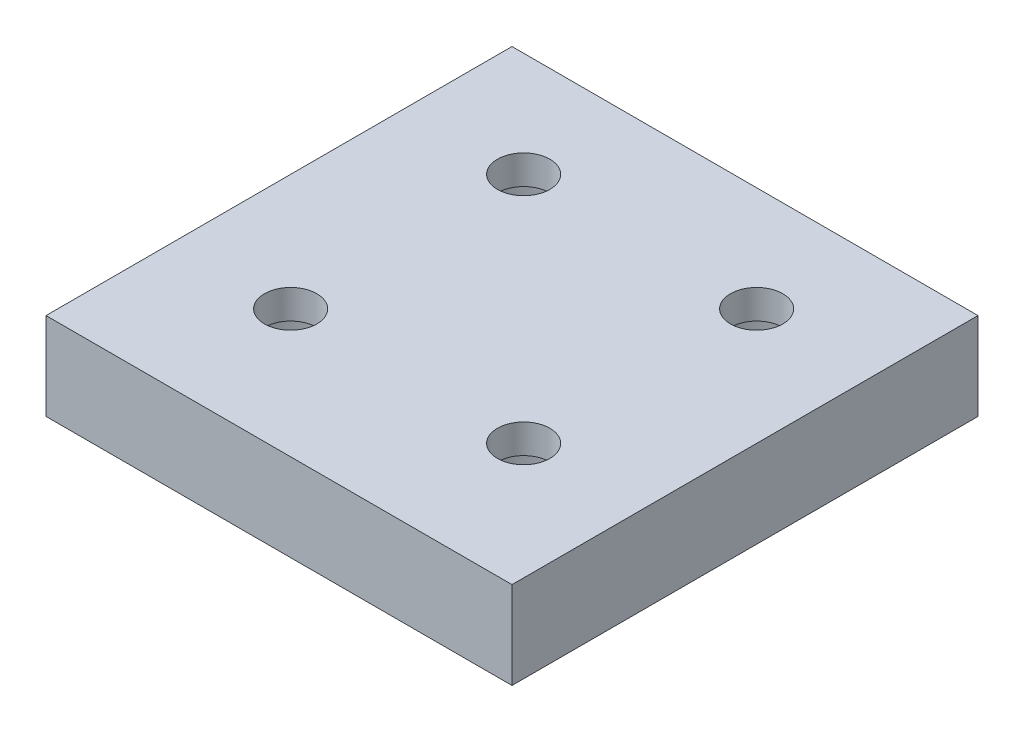
ISO-10303-21;
HEADER;
FILE_DESCRIPTION(('STEP AP214'),'2;1');
FILE_NAME('part.step','',(''),(''),'','','');
FILE_SCHEMA(('AUTOMOTIVE_DESIGN { 1 0 10303 214 1 1 1 1 }'));
ENDSEC;
DATA;
#1=APPLICATION_CONTEXT('core data for automotive mechanical design processes');
#2=APPLICATION_PROTOCOL_DEFINITION('international standard','automotive_design',2000,#1);
#3=PRODUCT_CONTEXT('',#1,'mechanical');
#4=PRODUCT('Part','Part','',(#3));
#5=PRODUCT_RELATED_PRODUCT_CATEGORY('part','',(#4));
#6=PRODUCT_DEFINITION_FORMATION('','',#4);
#7=PRODUCT_DEFINITION_CONTEXT('part definition',#1,'design');
#8=PRODUCT_DEFINITION('design','',#6,#7);
#9=PRODUCT_DEFINITION_SHAPE('','',#8);
#10=(LENGTH_UNIT() NAMED_UNIT(*) SI_UNIT(.MILLI.,.METRE.));
#11=(NAMED_UNIT(*) PLANE_ANGLE_UNIT() SI_UNIT($,.RADIAN.));
#12=(NAMED_UNIT(*) SI_UNIT($,.STERADIAN.) SOLID_ANGLE_UNIT());
#13=UNCERTAINTY_MEASURE_WITH_UNIT(LENGTH_MEASURE(1.E-05),#10,'distance_accuracy_value','');
#14=(GEOMETRIC_REPRESENTATION_CONTEXT(3) GLOBAL_UNCERTAINTY_ASSIGNED_CONTEXT((#13)) GLOBAL_UNIT_ASSIGNED_CONTEXT((#10,
#11,#12)) REPRESENTATION_CONTEXT('',''));
#15=CARTESIAN_POINT('',(0.,0.,0.));
#16=DIRECTION('',(0.,0.,1.));
#17=DIRECTION('',(1.,0.,0.));
#18=AXIS2_PLACEMENT_3D('',#15,#16,#17);
#19=CARTESIAN_POINT('',(0.,0.,0.));
#20=DIRECTION('',(0.,1.,0.));
#21=DIRECTION('',(0.,0.,1.));
#22=AXIS2_PLACEMENT_3D('',#19,#20,#21);
#23=PLANE('',#22);
#24=CARTESIAN_POINT('',(10.,0.,9.));
#25=DIRECTION('',(0.,1.,0.));
#26=DIRECTION('',(0.,0.,1.));
#27=AXIS2_PLACEMENT_3D('',#24,#25,#26);
#28=CIRCLE('',#27,7.25);
#29=CARTESIAN_POINT('',(10.,0.,16.25));
#30=VERTEX_POINT('',#29);
#31=EDGE_CURVE('E398',#30,#30,#28,.F.);
#32=ORIENTED_EDGE('',*,*,#31,.T.);
#33=EDGE_LOOP('',(#32));
#34=FACE_BOUND('',#33,.T.);
#35=CARTESIAN_POINT('',(10.,0.,9.));
#36=DIRECTION('',(0.,-1.,0.));
#37=DIRECTION('',(0.,0.,-1.));
#38=AXIS2_PLACEMENT_3D('',#35,#36,#37);
#39=CIRCLE('',#38,6.25);
#40=CARTESIAN_POINT('',(10.,0.,2.75));
#41=VERTEX_POINT('',#40);
#42=EDGE_CURVE('E429',#41,#41,#39,.T.);
#43=ORIENTED_EDGE('',*,*,#42,.F.);
#44=EDGE_LOOP('',(#43));
#45=FACE_BOUND('',#44,.T.);
#46=ADVANCED_FACE('F187',(#34,#45),#23,.F.);
#47=CARTESIAN_POINT('',(-10.,0.,-11.));
#48=DIRECTION('',(0.,1.,0.));
#49=DIRECTION('',(0.,0.,1.));
#50=AXIS2_PLACEMENT_3D('',#47,#48,#49);
#51=CIRCLE('',#50,7.25);
#52=CARTESIAN_POINT('',(-10.,0.,-3.75));
#53=VERTEX_POINT('',#52);
#54=EDGE_CURVE('E399',#53,#53,#51,.F.);
#55=ORIENTED_EDGE('',*,*,#54,.T.);
#56=EDGE_LOOP('',(#55));
#57=FACE_BOUND('',#56,.T.);
#58=CARTESIAN_POINT('',(-10.,0.,-11.));
#59=DIRECTION('',(0.,-1.,0.));
#60=DIRECTION('',(0.,0.,-1.));
#61=AXIS2_PLACEMENT_3D('',#58,#59,#60);
#62=CIRCLE('',#61,6.25);
#63=CARTESIAN_POINT('',(-10.,0.,-17.25));
#64=VERTEX_POINT('',#63);
#65=EDGE_CURVE('E436',#64,#64,#62,.T.);
#66=ORIENTED_EDGE('',*,*,#65,.F.);
#67=EDGE_LOOP('',(#66));
#68=FACE_BOUND('',#67,.T.);
#69=ADVANCED_FACE('F491',(#57,#68),#23,.F.);
#70=CARTESIAN_POINT('',(9.99999999999999,0.,-11.));
#71=DIRECTION('',(0.,1.,0.));
#72=DIRECTION('',(0.,0.,1.));
#73=AXIS2_PLACEMENT_3D('',#70,#71,#72);
#74=CIRCLE('',#73,7.25);
#75=CARTESIAN_POINT('',(9.99999999999999,0.,-3.75));
#76=VERTEX_POINT('',#75);
#77=EDGE_CURVE('E405',#76,#76,#74,.F.);
#78=ORIENTED_EDGE('',*,*,#77,.T.);
#79=EDGE_LOOP('',(#78));
#80=FACE_BOUND('',#79,.T.);
#81=CARTESIAN_POINT('',(9.99999999999999,0.,-11.));
#82=DIRECTION('',(0.,-1.,0.));
#83=DIRECTION('',(0.,0.,-1.));
#84=AXIS2_PLACEMENT_3D('',#81,#82,#83);
#85=CIRCLE('',#84,6.25);
#86=CARTESIAN_POINT('',(9.99999999999999,0.,-17.25));
#87=VERTEX_POINT('',#86);
#88=EDGE_CURVE('E423',#87,#87,#85,.T.);
#89=ORIENTED_EDGE('',*,*,#88,.F.);
#90=EDGE_LOOP('',(#89));
#91=FACE_BOUND('',#90,.T.);
#92=ADVANCED_FACE('F495',(#80,#91),#23,.F.);
#93=CARTESIAN_POINT('',(-10.,0.,9.));
#94=DIRECTION('',(0.,1.,0.));
#95=DIRECTION('',(0.,0.,1.));
#96=AXIS2_PLACEMENT_3D('',#93,#94,#95);
#97=CIRCLE('',#96,7.25);
#98=CARTESIAN_POINT('',(-10.,0.,16.25));
#99=VERTEX_POINT('',#98);
#100=EDGE_CURVE('E392',#99,#99,#97,.F.);
#101=ORIENTED_EDGE('',*,*,#100,.T.);
#102=EDGE_LOOP('',(#101));
#103=FACE_BOUND('',#102,.T.);
#104=CARTESIAN_POINT('',(-10.,0.,9.));
#105=DIRECTION('',(0.,-1.,0.));
#106=DIRECTION('',(0.,0.,-1.));
#107=AXIS2_PLACEMENT_3D('',#104,#105,#106);
#108=CIRCLE('',#107,6.25);
#109=CARTESIAN_POINT('',(-10.,0.,2.75));
#110=VERTEX_POINT('',#109);
#111=EDGE_CURVE('E432',#110,#110,#108,.T.);
#112=ORIENTED_EDGE('',*,*,#111,.F.);
#113=EDGE_LOOP('',(#112));
#114=FACE_BOUND('',#113,.T.);
#115=ADVANCED_FACE('F477',(#103,#114),#23,.F.);
#116=CARTESIAN_POINT('',(-10.,7.5,-11.));
#117=DIRECTION('',(0.,-1.,0.));
#118=DIRECTION('',(0.,0.,-1.));
#119=AXIS2_PLACEMENT_3D('',#116,#117,#118);
#120=CYLINDRICAL_SURFACE('',#119,2.25);
#121=CARTESIAN_POINT('',(-10.,7.5,-11.));
#122=DIRECTION('',(0.,1.,0.));
#123=DIRECTION('',(0.,0.,1.));
#124=AXIS2_PLACEMENT_3D('',#121,#122,#123);
#125=CIRCLE('',#124,2.25);
#126=CARTESIAN_POINT('',(-10.,7.5,-8.75));
#127=VERTEX_POINT('',#126);
#128=EDGE_CURVE('E295',#127,#127,#125,.T.);
#129=ORIENTED_EDGE('',*,*,#128,.T.);
#130=EDGE_LOOP('',(#129));
#131=FACE_BOUND('',#130,.T.);
#132=CARTESIAN_POINT('',(-10.,5.,-11.));
#133=DIRECTION('',(0.,-1.,0.));
#134=DIRECTION('',(0.,0.,-1.));
#135=AXIS2_PLACEMENT_3D('',#132,#133,#134);
#136=CIRCLE('',#135,2.25);
#137=CARTESIAN_POINT('',(-10.,5.,-13.25));
#138=VERTEX_POINT('',#137);
#139=EDGE_CURVE('E318',#138,#138,#136,.T.);
#140=ORIENTED_EDGE('',*,*,#139,.T.);
#141=EDGE_LOOP('',(#140));
#142=FACE_BOUND('',#141,.T.);
#143=ADVANCED_FACE('F494',(#131,#142),#120,.F.);
#144=CARTESIAN_POINT('',(-10.,7.5,9.));
#145=DIRECTION('',(0.,-1.,0.));
#146=DIRECTION('',(0.,0.,-1.));
#147=AXIS2_PLACEMENT_3D('',#144,#145,#146);
#148=CYLINDRICAL_SURFACE('',#147,2.25);
#149=CARTESIAN_POINT('',(-10.,7.5,9.));
#150=DIRECTION('',(0.,1.,0.));
#151=DIRECTION('',(0.,0.,1.));
#152=AXIS2_PLACEMENT_3D('',#149,#150,#151);
#153=CIRCLE('',#152,2.25);
#154=CARTESIAN_POINT('',(-10.,7.5,11.25));
#155=VERTEX_POINT('',#154);
#156=EDGE_CURVE('E445',#155,#155,#153,.T.);
#157=ORIENTED_EDGE('',*,*,#156,.T.);
#158=EDGE_LOOP('',(#157));
#159=FACE_BOUND('',#158,.T.);
#160=CARTESIAN_POINT('',(-10.,5.,9.));
#161=DIRECTION('',(0.,-1.,0.));
#162=DIRECTION('',(0.,0.,-1.));
#163=AXIS2_PLACEMENT_3D('',#160,#161,#162);
#164=CIRCLE('',#163,2.25);
#165=CARTESIAN_POINT('',(-10.,5.,6.75));
#166=VERTEX_POINT('',#165);
#167=EDGE_CURVE('E315',#166,#166,#164,.T.);
#168=ORIENTED_EDGE('',*,*,#167,.T.);
#169=EDGE_LOOP('',(#168));
#170=FACE_BOUND('',#169,.T.);
#171=ADVANCED_FACE('F502',(#159,#170),#148,.F.);
#172=CARTESIAN_POINT('',(10.,7.5,9.));
#173=DIRECTION('',(0.,-1.,0.));
#174=DIRECTION('',(0.,0.,-1.));
#175=AXIS2_PLACEMENT_3D('',#172,#173,#174);
#176=CYLINDRICAL_SURFACE('',#175,2.25);
#177=CARTESIAN_POINT('',(10.,7.5,9.));
#178=DIRECTION('',(0.,1.,0.));
#179=DIRECTION('',(0.,0.,1.));
#180=AXIS2_PLACEMENT_3D('',#177,#178,#179);
#181=CIRCLE('',#180,2.25);
#182=CARTESIAN_POINT('',(10.,7.5,11.25));
#183=VERTEX_POINT('',#182);
#184=EDGE_CURVE('E448',#183,#183,#181,.T.);
#185=ORIENTED_EDGE('',*,*,#184,.T.);
#186=EDGE_LOOP('',(#185));
#187=FACE_BOUND('',#186,.T.);
#188=CARTESIAN_POINT('',(10.,5.,9.));
#189=DIRECTION('',(0.,-1.,0.));
#190=DIRECTION('',(0.,0.,-1.));
#191=AXIS2_PLACEMENT_3D('',#188,#189,#190);
#192=CIRCLE('',#191,2.25);
#193=CARTESIAN_POINT('',(10.,5.,6.75));
#194=VERTEX_POINT('',#193);
#195=EDGE_CURVE('E311',#194,#194,#192,.T.);
#196=ORIENTED_EDGE('',*,*,#195,.T.);
#197=EDGE_LOOP('',(#196));
#198=FACE_BOUND('',#197,.T.);
#199=ADVANCED_FACE('F485',(#187,#198),#176,.F.);
#200=CARTESIAN_POINT('',(9.99999999999999,7.5,-11.));
#201=DIRECTION('',(0.,-1.,0.));
#202=DIRECTION('',(0.,0.,-1.));
#203=AXIS2_PLACEMENT_3D('',#200,#201,#202);
#204=CYLINDRICAL_SURFACE('',#203,2.25);
#205=CARTESIAN_POINT('',(9.99999999999999,7.5,-11.));
#206=DIRECTION('',(0.,1.,0.));
#207=DIRECTION('',(0.,0.,1.));
#208=AXIS2_PLACEMENT_3D('',#205,#206,#207);
#209=CIRCLE('',#208,2.25);
#210=CARTESIAN_POINT('',(9.99999999999999,7.5,-8.75));
#211=VERTEX_POINT('',#210);
#212=EDGE_CURVE('E452',#211,#211,#209,.T.);
#213=ORIENTED_EDGE('',*,*,#212,.T.);
#214=EDGE_LOOP('',(#213));
#215=FACE_BOUND('',#214,.T.);
#216=CARTESIAN_POINT('',(9.99999999999999,5.,-11.));
#217=DIRECTION('',(0.,-1.,0.));
#218=DIRECTION('',(0.,0.,-1.));
#219=AXIS2_PLACEMENT_3D('',#216,#217,#218);
#220=CIRCLE('',#219,2.25);
#221=CARTESIAN_POINT('',(9.99999999999999,5.,-13.25));
#222=VERTEX_POINT('',#221);
#223=EDGE_CURVE('E308',#222,#222,#220,.T.);
#224=ORIENTED_EDGE('',*,*,#223,.T.);
#225=EDGE_LOOP('',(#224));
#226=FACE_BOUND('',#225,.T.);
#227=ADVANCED_FACE('F475',(#215,#226),#204,.F.);
#228=DIRECTION('',(0.,0.,1.));
#229=VECTOR('',#228,1.);
#230=CARTESIAN_POINT('',(19.,0.,0.));
#231=LINE('',#230,#229);
#232=CARTESIAN_POINT('',(19.,0.,-15.));
#233=VERTEX_POINT('',#232);
#234=CARTESIAN_POINT('',(19.,0.,15.));
#235=VERTEX_POINT('',#234);
#236=EDGE_CURVE('E352',#233,#235,#231,.T.);
#237=ORIENTED_EDGE('',*,*,#236,.F.);
#238=CARTESIAN_POINT('',(15.,0.,-15.));
#239=DIRECTION('',(0.,1.,0.));
#240=DIRECTION('',(0.,0.,1.));
#241=AXIS2_PLACEMENT_3D('',#238,#239,#240);
#242=CIRCLE('',#241,4.);
#243=CARTESIAN_POINT('',(15.,0.,-19.));
#244=VERTEX_POINT('',#243);
#245=EDGE_CURVE('E345',#233,#244,#242,.T.);
#246=ORIENTED_EDGE('',*,*,#245,.T.);
#247=DIRECTION('',(-1.,0.,0.));
#248=VECTOR('',#247,1.);
#249=CARTESIAN_POINT('',(0.,0.,-19.));
#250=LINE('',#249,#248);
#251=CARTESIAN_POINT('',(-15.,0.,-19.));
#252=VERTEX_POINT('',#251);
#253=EDGE_CURVE('E417',#244,#252,#250,.T.);
#254=ORIENTED_EDGE('',*,*,#253,.T.);
#255=CARTESIAN_POINT('',(-15.,0.,-15.));
#256=DIRECTION('',(0.,1.,0.));
#257=DIRECTION('',(0.,0.,1.));
#258=AXIS2_PLACEMENT_3D('',#255,#256,#257);
#259=CIRCLE('',#258,4.);
#260=CARTESIAN_POINT('',(-19.,0.,-15.));
#261=VERTEX_POINT('',#260);
#262=EDGE_CURVE('E347',#252,#261,#259,.T.);
#263=ORIENTED_EDGE('',*,*,#262,.T.);
#264=DIRECTION('',(0.,0.,1.));
#265=VECTOR('',#264,1.);
#266=CARTESIAN_POINT('',(-19.,0.,0.));
#267=LINE('',#266,#265);
#268=CARTESIAN_POINT('',(-19.,0.,15.));
#269=VERTEX_POINT('',#268);
#270=EDGE_CURVE('E415',#261,#269,#267,.T.);
#271=ORIENTED_EDGE('',*,*,#270,.T.);
#272=CARTESIAN_POINT('',(-15.,0.,15.));
#273=DIRECTION('',(0.,1.,0.));
#274=DIRECTION('',(0.,0.,1.));
#275=AXIS2_PLACEMENT_3D('',#272,#273,#274);
#276=CIRCLE('',#275,4.);
#277=CARTESIAN_POINT('',(-15.,0.,19.));
#278=VERTEX_POINT('',#277);
#279=EDGE_CURVE('E12',#269,#278,#276,.T.);
#280=ORIENTED_EDGE('',*,*,#279,.T.);
#281=DIRECTION('',(-1.,0.,0.));
#282=VECTOR('',#281,1.);
#283=CARTESIAN_POINT('',(0.,0.,19.));
#284=LINE('',#283,#282);
#285=CARTESIAN_POINT('',(15.,0.,19.));
#286=VERTEX_POINT('',#285);
#287=EDGE_CURVE('E353',#286,#278,#284,.T.);
#288=ORIENTED_EDGE('',*,*,#287,.F.);
#289=CARTESIAN_POINT('',(15.,0.,15.));
#290=DIRECTION('',(0.,1.,0.));
#291=DIRECTION('',(0.,0.,1.));
#292=AXIS2_PLACEMENT_3D('',#289,#290,#291);
#293=CIRCLE('',#292,4.);
#294=EDGE_CURVE('E195',#286,#235,#293,.T.);
#295=ORIENTED_EDGE('',*,*,#294,.T.);
#296=EDGE_LOOP('',(#237,#246,#254,#263,#271,#280,#288,#295));
#297=FACE_BOUND('',#296,.T.);
#298=DIRECTION('',(-1.,0.,0.));
#299=VECTOR('',#298,1.);
#300=CARTESIAN_POINT('',(0.,0.,-20.));
#301=LINE('',#300,#299);
#302=CARTESIAN_POINT('',(20.,0.,-20.));
#303=VERTEX_POINT('',#302);
#304=CARTESIAN_POINT('',(-20.,0.,-20.));
#305=VERTEX_POINT('',#304);
#306=EDGE_CURVE('E299',#303,#305,#301,.T.);
#307=ORIENTED_EDGE('',*,*,#306,.F.);
#308=DIRECTION('',(0.,0.,1.));
#309=VECTOR('',#308,1.);
#310=CARTESIAN_POINT('',(20.,0.,0.));
#311=LINE('',#310,#309);
#312=CARTESIAN_POINT('',(20.,0.,20.));
#313=VERTEX_POINT('',#312);
#314=EDGE_CURVE('E449',#303,#313,#311,.T.);
#315=ORIENTED_EDGE('',*,*,#314,.T.);
#316=DIRECTION('',(-1.,0.,0.));
#317=VECTOR('',#316,1.);
#318=CARTESIAN_POINT('',(0.,0.,20.));
#319=LINE('',#318,#317);
#320=CARTESIAN_POINT('',(-20.,0.,20.));
#321=VERTEX_POINT('',#320);
#322=EDGE_CURVE('E463',#313,#321,#319,.T.);
#323=ORIENTED_EDGE('',*,*,#322,.T.);
#324=DIRECTION('',(0.,0.,1.));
#325=VECTOR('',#324,1.);
#326=CARTESIAN_POINT('',(-20.,0.,0.));
#327=LINE('',#326,#325);
#328=EDGE_CURVE('E461',#305,#321,#327,.T.);
#329=ORIENTED_EDGE('',*,*,#328,.F.);
#330=EDGE_LOOP('',(#307,#315,#323,#329));
#331=FACE_BOUND('',#330,.T.);
#332=ADVANCED_FACE('F350',(#297,#331),#23,.F.);
#333=CARTESIAN_POINT('',(-20.,7.5,0.));
#334=DIRECTION('',(1.,0.,0.));
#335=DIRECTION('',(0.,0.,-1.));
#336=AXIS2_PLACEMENT_3D('',#333,#334,#335);
#337=PLANE('',#336);
#338=ORIENTED_EDGE('',*,*,#328,.T.);
#339=DIRECTION('',(0.,-1.,0.));
#340=VECTOR('',#339,1.);
#341=CARTESIAN_POINT('',(-20.,7.5,20.));
#342=LINE('',#341,#340);
#343=CARTESIAN_POINT('',(-20.,7.5,20.));
#344=VERTEX_POINT('',#343);
#345=EDGE_CURVE('E282',#344,#321,#342,.T.);
#346=ORIENTED_EDGE('',*,*,#345,.F.);
#347=DIRECTION('',(0.,0.,1.));
#348=VECTOR('',#347,1.);
#349=CARTESIAN_POINT('',(-20.,7.5,0.));
#350=LINE('',#349,#348);
#351=CARTESIAN_POINT('',(-20.,7.5,-20.));
#352=VERTEX_POINT('',#351);
#353=EDGE_CURVE('E275',#352,#344,#350,.T.);
#354=ORIENTED_EDGE('',*,*,#353,.F.);
#355=DIRECTION('',(0.,-1.,0.));
#356=VECTOR('',#355,1.);
#357=CARTESIAN_POINT('',(-20.,7.5,-20.));
#358=LINE('',#357,#356);
#359=EDGE_CURVE('E280',#352,#305,#358,.T.);
#360=ORIENTED_EDGE('',*,*,#359,.T.);
#361=EDGE_LOOP('',(#338,#346,#354,#360));
#362=FACE_BOUND('',#361,.T.);
#363=ADVANCED_FACE('F278',(#362),#337,.F.);
#364=CARTESIAN_POINT('',(0.,7.5,-20.));
#365=DIRECTION('',(0.,0.,1.));
#366=DIRECTION('',(1.,0.,0.));
#367=AXIS2_PLACEMENT_3D('',#364,#365,#366);
#368=PLANE('',#367);
#369=ORIENTED_EDGE('',*,*,#306,.T.);
#370=ORIENTED_EDGE('',*,*,#359,.F.);
#371=DIRECTION('',(-1.,0.,0.));
#372=VECTOR('',#371,1.);
#373=CARTESIAN_POINT('',(0.,7.5,-20.));
#374=LINE('',#373,#372);
#375=CARTESIAN_POINT('',(20.,7.5,-20.));
#376=VERTEX_POINT('',#375);
#377=EDGE_CURVE('E287',#376,#352,#374,.T.);
#378=ORIENTED_EDGE('',*,*,#377,.F.);
#379=DIRECTION('',(0.,-1.,0.));
#380=VECTOR('',#379,1.);
#381=CARTESIAN_POINT('',(20.,7.5,-20.));
#382=LINE('',#381,#380);
#383=EDGE_CURVE('E459',#376,#303,#382,.T.);
#384=ORIENTED_EDGE('',*,*,#383,.T.);
#385=EDGE_LOOP('',(#369,#370,#378,#384));
#386=FACE_BOUND('',#385,.T.);
#387=ADVANCED_FACE('F297',(#386),#368,.F.);
#388=CARTESIAN_POINT('',(20.,7.5,0.));
#389=DIRECTION('',(1.,0.,0.));
#390=DIRECTION('',(0.,0.,-1.));
#391=AXIS2_PLACEMENT_3D('',#388,#389,#390);
#392=PLANE('',#391);
#393=ORIENTED_EDGE('',*,*,#314,.F.);
#394=ORIENTED_EDGE('',*,*,#383,.F.);
#395=DIRECTION('',(0.,0.,1.));
#396=VECTOR('',#395,1.);
#397=CARTESIAN_POINT('',(20.,7.5,0.));
#398=LINE('',#397,#396);
#399=CARTESIAN_POINT('',(20.,7.5,20.));
#400=VERTEX_POINT('',#399);
#401=EDGE_CURVE('E293',#376,#400,#398,.T.);
#402=ORIENTED_EDGE('',*,*,#401,.T.);
#403=DIRECTION('',(0.,-1.,0.));
#404=VECTOR('',#403,1.);
#405=CARTESIAN_POINT('',(20.,7.5,20.));
#406=LINE('',#405,#404);
#407=EDGE_CURVE('E304',#400,#313,#406,.T.);
#408=ORIENTED_EDGE('',*,*,#407,.T.);
#409=EDGE_LOOP('',(#393,#394,#402,#408));
#410=FACE_BOUND('',#409,.T.);
#411=ADVANCED_FACE('F471',(#410),#392,.T.);
#412=CARTESIAN_POINT('',(0.,7.5,20.));
#413=DIRECTION('',(0.,0.,1.));
#414=DIRECTION('',(1.,0.,0.));
#415=AXIS2_PLACEMENT_3D('',#412,#413,#414);
#416=PLANE('',#415);
#417=ORIENTED_EDGE('',*,*,#322,.F.);
#418=ORIENTED_EDGE('',*,*,#407,.F.);
#419=DIRECTION('',(-1.,0.,0.));
#420=VECTOR('',#419,1.);
#421=CARTESIAN_POINT('',(0.,7.5,20.));
#422=LINE('',#421,#420);
#423=EDGE_CURVE('E286',#400,#344,#422,.T.);
#424=ORIENTED_EDGE('',*,*,#423,.T.);
#425=ORIENTED_EDGE('',*,*,#345,.T.);
#426=EDGE_LOOP('',(#417,#418,#424,#425));
#427=FACE_BOUND('',#426,.T.);
#428=ADVANCED_FACE('F473',(#427),#416,.T.);
#429=CARTESIAN_POINT('',(0.,7.5,0.));
#430=DIRECTION('',(0.,1.,0.));
#431=DIRECTION('',(0.,0.,1.));
#432=AXIS2_PLACEMENT_3D('',#429,#430,#431);
#433=PLANE('',#432);
#434=ORIENTED_EDGE('',*,*,#156,.F.);
#435=EDGE_LOOP('',(#434));
#436=FACE_BOUND('',#435,.T.);
#437=ORIENTED_EDGE('',*,*,#184,.F.);
#438=EDGE_LOOP('',(#437));
#439=FACE_BOUND('',#438,.T.);
#440=ORIENTED_EDGE('',*,*,#212,.F.);
#441=EDGE_LOOP('',(#440));
#442=FACE_BOUND('',#441,.T.);
#443=ORIENTED_EDGE('',*,*,#128,.F.);
#444=EDGE_LOOP('',(#443));
#445=FACE_BOUND('',#444,.T.);
#446=ORIENTED_EDGE('',*,*,#377,.T.);
#447=ORIENTED_EDGE('',*,*,#353,.T.);
#448=ORIENTED_EDGE('',*,*,#423,.F.);
#449=ORIENTED_EDGE('',*,*,#401,.F.);
#450=EDGE_LOOP('',(#446,#447,#448,#449));
#451=FACE_BOUND('',#450,.T.);
#452=ADVANCED_FACE('F291',(#436,#439,#442,#445,#451),#433,.T.);
#453=CARTESIAN_POINT('',(9.99999999999999,5.,-11.));
#454=DIRECTION('',(0.,-1.,0.));
#455=DIRECTION('',(0.,0.,-1.));
#456=AXIS2_PLACEMENT_3D('',#453,#454,#455);
#457=CYLINDRICAL_SURFACE('',#456,6.25);
#458=CARTESIAN_POINT('',(9.99999999999999,5.,-11.));
#459=DIRECTION('',(0.,-1.,0.));
#460=DIRECTION('',(0.,0.,-1.));
#461=AXIS2_PLACEMENT_3D('',#458,#459,#460);
#462=CIRCLE('',#461,6.25);
#463=CARTESIAN_POINT('',(9.99999999999999,5.,-17.25));
#464=VERTEX_POINT('',#463);
#465=EDGE_CURVE('E376',#464,#464,#462,.T.);
#466=ORIENTED_EDGE('',*,*,#465,.F.);
#467=EDGE_LOOP('',(#466));
#468=FACE_BOUND('',#467,.T.);
#469=ORIENTED_EDGE('',*,*,#88,.T.);
#470=EDGE_LOOP('',(#469));
#471=FACE_BOUND('',#470,.T.);
#472=ADVANCED_FACE('F529',(#468,#471),#457,.F.);
#473=CARTESIAN_POINT('',(9.99999999999999,5.,-11.));
#474=DIRECTION('',(0.,-1.,0.));
#475=DIRECTION('',(0.,0.,-1.));
#476=AXIS2_PLACEMENT_3D('',#473,#474,#475);
#477=PLANE('',#476);
#478=ORIENTED_EDGE('',*,*,#223,.F.);
#479=EDGE_LOOP('',(#478));
#480=FACE_BOUND('',#479,.T.);
#481=ORIENTED_EDGE('',*,*,#465,.T.);
#482=EDGE_LOOP('',(#481));
#483=FACE_BOUND('',#482,.T.);
#484=ADVANCED_FACE('F535',(#480,#483),#477,.T.);
#485=CARTESIAN_POINT('',(10.,5.,9.));
#486=DIRECTION('',(0.,-1.,0.));
#487=DIRECTION('',(0.,0.,-1.));
#488=AXIS2_PLACEMENT_3D('',#485,#486,#487);
#489=CYLINDRICAL_SURFACE('',#488,6.25);
#490=CARTESIAN_POINT('',(10.,5.,9.));
#491=DIRECTION('',(0.,-1.,0.));
#492=DIRECTION('',(0.,0.,-1.));
#493=AXIS2_PLACEMENT_3D('',#490,#491,#492);
#494=CIRCLE('',#493,6.25);
#495=CARTESIAN_POINT('',(10.,5.,2.75));
#496=VERTEX_POINT('',#495);
#497=EDGE_CURVE('E433',#496,#496,#494,.T.);
#498=ORIENTED_EDGE('',*,*,#497,.F.);
#499=EDGE_LOOP('',(#498));
#500=FACE_BOUND('',#499,.T.);
#501=ORIENTED_EDGE('',*,*,#42,.T.);
#502=EDGE_LOOP('',(#501));
#503=FACE_BOUND('',#502,.T.);
#504=ADVANCED_FACE('F523',(#500,#503),#489,.F.);
#505=CARTESIAN_POINT('',(10.,5.,9.));
#506=DIRECTION('',(0.,-1.,0.));
#507=DIRECTION('',(0.,0.,-1.));
#508=AXIS2_PLACEMENT_3D('',#505,#506,#507);
#509=PLANE('',#508);
#510=ORIENTED_EDGE('',*,*,#195,.F.);
#511=EDGE_LOOP('',(#510));
#512=FACE_BOUND('',#511,.T.);
#513=ORIENTED_EDGE('',*,*,#497,.T.);
#514=EDGE_LOOP('',(#513));
#515=FACE_BOUND('',#514,.T.);
#516=ADVANCED_FACE('F513',(#512,#515),#509,.T.);
#517=CARTESIAN_POINT('',(-10.,5.,9.));
#518=DIRECTION('',(0.,-1.,0.));
#519=DIRECTION('',(0.,0.,-1.));
#520=AXIS2_PLACEMENT_3D('',#517,#518,#519);
#521=CYLINDRICAL_SURFACE('',#520,6.25);
#522=CARTESIAN_POINT('',(-10.,5.,9.));
#523=DIRECTION('',(0.,-1.,0.));
#524=DIRECTION('',(0.,0.,-1.));
#525=AXIS2_PLACEMENT_3D('',#522,#523,#524);
#526=CIRCLE('',#525,6.25);
#527=CARTESIAN_POINT('',(-10.,5.,2.75));
#528=VERTEX_POINT('',#527);
#529=EDGE_CURVE('E312',#528,#528,#526,.T.);
#530=ORIENTED_EDGE('',*,*,#529,.F.);
#531=EDGE_LOOP('',(#530));
#532=FACE_BOUND('',#531,.T.);
#533=ORIENTED_EDGE('',*,*,#111,.T.);
#534=EDGE_LOOP('',(#533));
#535=FACE_BOUND('',#534,.T.);
#536=ADVANCED_FACE('F510',(#532,#535),#521,.F.);
#537=CARTESIAN_POINT('',(-10.,5.,9.));
#538=DIRECTION('',(0.,-1.,0.));
#539=DIRECTION('',(0.,0.,-1.));
#540=AXIS2_PLACEMENT_3D('',#537,#538,#539);
#541=PLANE('',#540);
#542=ORIENTED_EDGE('',*,*,#167,.F.);
#543=EDGE_LOOP('',(#542));
#544=FACE_BOUND('',#543,.T.);
#545=ORIENTED_EDGE('',*,*,#529,.T.);
#546=EDGE_LOOP('',(#545));
#547=FACE_BOUND('',#546,.T.);
#548=ADVANCED_FACE('F512',(#544,#547),#541,.T.);
#549=CARTESIAN_POINT('',(-10.,5.,-11.));
#550=DIRECTION('',(0.,-1.,0.));
#551=DIRECTION('',(0.,0.,-1.));
#552=AXIS2_PLACEMENT_3D('',#549,#550,#551);
#553=CYLINDRICAL_SURFACE('',#552,6.25);
#554=CARTESIAN_POINT('',(-10.,5.,-11.));
#555=DIRECTION('',(0.,-1.,0.));
#556=DIRECTION('',(0.,0.,-1.));
#557=AXIS2_PLACEMENT_3D('',#554,#555,#556);
#558=CIRCLE('',#557,6.25);
#559=CARTESIAN_POINT('',(-10.,5.,-17.25));
#560=VERTEX_POINT('',#559);
#561=EDGE_CURVE('E426',#560,#560,#558,.T.);
#562=ORIENTED_EDGE('',*,*,#561,.F.);
#563=EDGE_LOOP('',(#562));
#564=FACE_BOUND('',#563,.T.);
#565=ORIENTED_EDGE('',*,*,#65,.T.);
#566=EDGE_LOOP('',(#565));
#567=FACE_BOUND('',#566,.T.);
#568=ADVANCED_FACE('F520',(#564,#567),#553,.F.);
#569=CARTESIAN_POINT('',(-10.,5.,-11.));
#570=DIRECTION('',(0.,-1.,0.));
#571=DIRECTION('',(0.,0.,-1.));
#572=AXIS2_PLACEMENT_3D('',#569,#570,#571);
#573=PLANE('',#572);
#574=ORIENTED_EDGE('',*,*,#139,.F.);
#575=EDGE_LOOP('',(#574));
#576=FACE_BOUND('',#575,.T.);
#577=ORIENTED_EDGE('',*,*,#561,.T.);
#578=EDGE_LOOP('',(#577));
#579=FACE_BOUND('',#578,.T.);
#580=ADVANCED_FACE('F549',(#576,#579),#573,.T.);
#581=CARTESIAN_POINT('',(-10.,7.5,-11.));
#582=DIRECTION('',(0.,-1.,0.));
#583=DIRECTION('',(0.,0.,-1.));
#584=AXIS2_PLACEMENT_3D('',#581,#582,#583);
#585=CYLINDRICAL_SURFACE('',#584,3.25);
#586=CARTESIAN_POINT('',(-10.,6.5,-11.));
#587=DIRECTION('',(0.,1.,0.));
#588=DIRECTION('',(0.,0.,1.));
#589=AXIS2_PLACEMENT_3D('',#586,#587,#588);
#590=CIRCLE('',#589,3.25);
#591=CARTESIAN_POINT('',(-10.,6.5,-7.75));
#592=VERTEX_POINT('',#591);
#593=EDGE_CURVE('E862',#592,#592,#590,.T.);
#594=ORIENTED_EDGE('',*,*,#593,.F.);
#595=EDGE_LOOP('',(#594));
#596=FACE_BOUND('',#595,.T.);
#597=CARTESIAN_POINT('',(-10.,6.,-11.));
#598=DIRECTION('',(0.,-1.,0.));
#599=DIRECTION('',(0.,0.,-1.));
#600=AXIS2_PLACEMENT_3D('',#597,#598,#599);
#601=CIRCLE('',#600,3.25);
#602=CARTESIAN_POINT('',(-10.,6.,-14.25));
#603=VERTEX_POINT('',#602);
#604=EDGE_CURVE('E386',#603,#603,#601,.T.);
#605=ORIENTED_EDGE('',*,*,#604,.F.);
#606=EDGE_LOOP('',(#605));
#607=FACE_BOUND('',#606,.T.);
#608=ADVANCED_FACE('F552',(#596,#607),#585,.T.);
#609=CARTESIAN_POINT('',(-10.,7.5,9.));
#610=DIRECTION('',(0.,-1.,0.));
#611=DIRECTION('',(0.,0.,-1.));
#612=AXIS2_PLACEMENT_3D('',#609,#610,#611);
#613=CYLINDRICAL_SURFACE('',#612,3.25);
#614=CARTESIAN_POINT('',(-10.,6.5,9.));
#615=DIRECTION('',(0.,1.,0.));
#616=DIRECTION('',(0.,0.,1.));
#617=AXIS2_PLACEMENT_3D('',#614,#615,#616);
#618=CIRCLE('',#617,3.25);
#619=CARTESIAN_POINT('',(-10.,6.5,12.25));
#620=VERTEX_POINT('',#619);
#621=EDGE_CURVE('E359',#620,#620,#618,.T.);
#622=ORIENTED_EDGE('',*,*,#621,.F.);
#623=EDGE_LOOP('',(#622));
#624=FACE_BOUND('',#623,.T.);
#625=CARTESIAN_POINT('',(-10.,6.,9.));
#626=DIRECTION('',(0.,-1.,0.));
#627=DIRECTION('',(0.,0.,-1.));
#628=AXIS2_PLACEMENT_3D('',#625,#626,#627);
#629=CIRCLE('',#628,3.25);
#630=CARTESIAN_POINT('',(-10.,6.,5.75));
#631=VERTEX_POINT('',#630);
#632=EDGE_CURVE('E383',#631,#631,#629,.T.);
#633=ORIENTED_EDGE('',*,*,#632,.F.);
#634=EDGE_LOOP('',(#633));
#635=FACE_BOUND('',#634,.T.);
#636=ADVANCED_FACE('F653',(#624,#635),#613,.T.);
#637=CARTESIAN_POINT('',(10.,7.5,9.));
#638=DIRECTION('',(0.,-1.,0.));
#639=DIRECTION('',(0.,0.,-1.));
#640=AXIS2_PLACEMENT_3D('',#637,#638,#639);
#641=CYLINDRICAL_SURFACE('',#640,3.25);
#642=CARTESIAN_POINT('',(10.,6.5,9.));
#643=DIRECTION('',(0.,1.,0.));
#644=DIRECTION('',(0.,0.,1.));
#645=AXIS2_PLACEMENT_3D('',#642,#643,#644);
#646=CIRCLE('',#645,3.25);
#647=CARTESIAN_POINT('',(10.,6.5,12.25));
#648=VERTEX_POINT('',#647);
#649=EDGE_CURVE('E869',#648,#648,#646,.T.);
#650=ORIENTED_EDGE('',*,*,#649,.F.);
#651=EDGE_LOOP('',(#650));
#652=FACE_BOUND('',#651,.T.);
#653=CARTESIAN_POINT('',(10.,6.,9.));
#654=DIRECTION('',(0.,-1.,0.));
#655=DIRECTION('',(0.,0.,-1.));
#656=AXIS2_PLACEMENT_3D('',#653,#654,#655);
#657=CIRCLE('',#656,3.25);
#658=CARTESIAN_POINT('',(10.,6.,5.75));
#659=VERTEX_POINT('',#658);
#660=EDGE_CURVE('E387',#659,#659,#657,.T.);
#661=ORIENTED_EDGE('',*,*,#660,.F.);
#662=EDGE_LOOP('',(#661));
#663=FACE_BOUND('',#662,.T.);
#664=ADVANCED_FACE('F666',(#652,#663),#641,.T.);
#665=CARTESIAN_POINT('',(9.99999999999999,7.5,-11.));
#666=DIRECTION('',(0.,-1.,0.));
#667=DIRECTION('',(0.,0.,-1.));
#668=AXIS2_PLACEMENT_3D('',#665,#666,#667);
#669=CYLINDRICAL_SURFACE('',#668,3.25);
#670=CARTESIAN_POINT('',(9.99999999999999,6.5,-11.));
#671=DIRECTION('',(0.,1.,0.));
#672=DIRECTION('',(0.,0.,1.));
#673=AXIS2_PLACEMENT_3D('',#670,#671,#672);
#674=CIRCLE('',#673,3.25);
#675=CARTESIAN_POINT('',(9.99999999999999,6.5,-7.75));
#676=VERTEX_POINT('',#675);
#677=EDGE_CURVE('E864',#676,#676,#674,.T.);
#678=ORIENTED_EDGE('',*,*,#677,.F.);
#679=EDGE_LOOP('',(#678));
#680=FACE_BOUND('',#679,.T.);
#681=CARTESIAN_POINT('',(9.99999999999999,6.,-11.));
#682=DIRECTION('',(0.,-1.,0.));
#683=DIRECTION('',(0.,0.,-1.));
#684=AXIS2_PLACEMENT_3D('',#681,#682,#683);
#685=CIRCLE('',#684,3.25);
#686=CARTESIAN_POINT('',(9.99999999999999,6.,-14.25));
#687=VERTEX_POINT('',#686);
#688=EDGE_CURVE('E391',#687,#687,#685,.T.);
#689=ORIENTED_EDGE('',*,*,#688,.F.);
#690=EDGE_LOOP('',(#689));
#691=FACE_BOUND('',#690,.T.);
#692=ADVANCED_FACE('F679',(#680,#691),#669,.T.);
#693=CARTESIAN_POINT('',(-19.,7.5,0.));
#694=DIRECTION('',(1.,0.,0.));
#695=DIRECTION('',(0.,0.,-1.));
#696=AXIS2_PLACEMENT_3D('',#693,#694,#695);
#697=PLANE('',#696);
#698=ORIENTED_EDGE('',*,*,#270,.F.);
#699=DIRECTION('',(0.,-1.,0.));
#700=VECTOR('',#699,1.);
#701=CARTESIAN_POINT('',(-19.,6.5,-15.));
#702=LINE('',#701,#700);
#703=CARTESIAN_POINT('',(-19.,6.5,-15.));
#704=VERTEX_POINT('',#703);
#705=EDGE_CURVE('E339',#261,#704,#702,.F.);
#706=ORIENTED_EDGE('',*,*,#705,.T.);
#707=DIRECTION('',(0.,0.,1.));
#708=VECTOR('',#707,1.);
#709=CARTESIAN_POINT('',(-19.,6.5,0.));
#710=LINE('',#709,#708);
#711=CARTESIAN_POINT('',(-19.,6.5,15.));
#712=VERTEX_POINT('',#711);
#713=EDGE_CURVE('E374',#704,#712,#710,.T.);
#714=ORIENTED_EDGE('',*,*,#713,.T.);
#715=DIRECTION('',(0.,-1.,0.));
#716=VECTOR('',#715,1.);
#717=CARTESIAN_POINT('',(-19.,7.5,15.));
#718=LINE('',#717,#716);
#719=EDGE_CURVE('E336',#712,#269,#718,.T.);
#720=ORIENTED_EDGE('',*,*,#719,.T.);
#721=EDGE_LOOP('',(#698,#706,#714,#720));
#722=FACE_BOUND('',#721,.T.);
#723=ADVANCED_FACE('F692',(#722),#697,.T.);
#724=CARTESIAN_POINT('',(0.,7.5,-19.));
#725=DIRECTION('',(0.,0.,1.));
#726=DIRECTION('',(1.,0.,0.));
#727=AXIS2_PLACEMENT_3D('',#724,#725,#726);
#728=PLANE('',#727);
#729=ORIENTED_EDGE('',*,*,#253,.F.);
#730=DIRECTION('',(0.,-1.,0.));
#731=VECTOR('',#730,1.);
#732=CARTESIAN_POINT('',(15.,7.5,-19.));
#733=LINE('',#732,#731);
#734=CARTESIAN_POINT('',(15.,6.5,-19.));
#735=VERTEX_POINT('',#734);
#736=EDGE_CURVE('E326',#244,#735,#733,.F.);
#737=ORIENTED_EDGE('',*,*,#736,.T.);
#738=DIRECTION('',(-1.,0.,0.));
#739=VECTOR('',#738,1.);
#740=CARTESIAN_POINT('',(0.,6.5,-19.));
#741=LINE('',#740,#739);
#742=CARTESIAN_POINT('',(-15.,6.5,-19.));
#743=VERTEX_POINT('',#742);
#744=EDGE_CURVE('E379',#735,#743,#741,.T.);
#745=ORIENTED_EDGE('',*,*,#744,.T.);
#746=DIRECTION('',(0.,-1.,0.));
#747=VECTOR('',#746,1.);
#748=CARTESIAN_POINT('',(-15.,0.,-19.));
#749=LINE('',#748,#747);
#750=EDGE_CURVE('E323',#743,#252,#749,.T.);
#751=ORIENTED_EDGE('',*,*,#750,.T.);
#752=EDGE_LOOP('',(#729,#737,#745,#751));
#753=FACE_BOUND('',#752,.T.);
#754=ADVANCED_FACE('F705',(#753),#728,.T.);
#755=CARTESIAN_POINT('',(19.,7.5,0.));
#756=DIRECTION('',(1.,0.,0.));
#757=DIRECTION('',(0.,0.,-1.));
#758=AXIS2_PLACEMENT_3D('',#755,#756,#757);
#759=PLANE('',#758);
#760=DIRECTION('',(0.,0.,1.));
#761=VECTOR('',#760,1.);
#762=CARTESIAN_POINT('',(19.,6.5,0.));
#763=LINE('',#762,#761);
#764=CARTESIAN_POINT('',(19.,6.5,-15.));
#765=VERTEX_POINT('',#764);
#766=CARTESIAN_POINT('',(19.,6.5,15.));
#767=VERTEX_POINT('',#766);
#768=EDGE_CURVE('E370',#765,#767,#763,.T.);
#769=ORIENTED_EDGE('',*,*,#768,.F.);
#770=DIRECTION('',(0.,-1.,0.));
#771=VECTOR('',#770,1.);
#772=CARTESIAN_POINT('',(19.,7.5,-15.));
#773=LINE('',#772,#771);
#774=EDGE_CURVE('E302',#765,#233,#773,.T.);
#775=ORIENTED_EDGE('',*,*,#774,.T.);
#776=ORIENTED_EDGE('',*,*,#236,.T.);
#777=DIRECTION('',(0.,-1.,0.));
#778=VECTOR('',#777,1.);
#779=CARTESIAN_POINT('',(19.,6.5,15.));
#780=LINE('',#779,#778);
#781=EDGE_CURVE('E300',#235,#767,#780,.F.);
#782=ORIENTED_EDGE('',*,*,#781,.T.);
#783=EDGE_LOOP('',(#769,#775,#776,#782));
#784=FACE_BOUND('',#783,.T.);
#785=ADVANCED_FACE('F356',(#784),#759,.F.);
#786=CARTESIAN_POINT('',(0.,7.5,19.));
#787=DIRECTION('',(0.,0.,1.));
#788=DIRECTION('',(1.,0.,0.));
#789=AXIS2_PLACEMENT_3D('',#786,#787,#788);
#790=PLANE('',#789);
#791=DIRECTION('',(-1.,0.,0.));
#792=VECTOR('',#791,1.);
#793=CARTESIAN_POINT('',(0.,6.5,19.));
#794=LINE('',#793,#792);
#795=CARTESIAN_POINT('',(15.,6.5,19.));
#796=VERTEX_POINT('',#795);
#797=CARTESIAN_POINT('',(-15.,6.5,19.));
#798=VERTEX_POINT('',#797);
#799=EDGE_CURVE('E368',#796,#798,#794,.T.);
#800=ORIENTED_EDGE('',*,*,#799,.F.);
#801=DIRECTION('',(0.,-1.,0.));
#802=VECTOR('',#801,1.);
#803=CARTESIAN_POINT('',(15.,0.,19.));
#804=LINE('',#803,#802);
#805=EDGE_CURVE('E343',#796,#286,#804,.T.);
#806=ORIENTED_EDGE('',*,*,#805,.T.);
#807=ORIENTED_EDGE('',*,*,#287,.T.);
#808=DIRECTION('',(0.,-1.,0.));
#809=VECTOR('',#808,1.);
#810=CARTESIAN_POINT('',(-15.,7.5,19.));
#811=LINE('',#810,#809);
#812=EDGE_CURVE('E341',#278,#798,#811,.F.);
#813=ORIENTED_EDGE('',*,*,#812,.T.);
#814=EDGE_LOOP('',(#800,#806,#807,#813));
#815=FACE_BOUND('',#814,.T.);
#816=ADVANCED_FACE('F372',(#815),#790,.F.);
#817=CARTESIAN_POINT('',(0.,6.5,0.));
#818=DIRECTION('',(0.,1.,0.));
#819=DIRECTION('',(0.,0.,1.));
#820=AXIS2_PLACEMENT_3D('',#817,#818,#819);
#821=PLANE('',#820);
#822=ORIENTED_EDGE('',*,*,#621,.T.);
#823=EDGE_LOOP('',(#822));
#824=FACE_BOUND('',#823,.T.);
#825=ORIENTED_EDGE('',*,*,#649,.T.);
#826=EDGE_LOOP('',(#825));
#827=FACE_BOUND('',#826,.T.);
#828=ORIENTED_EDGE('',*,*,#677,.T.);
#829=EDGE_LOOP('',(#828));
#830=FACE_BOUND('',#829,.T.);
#831=ORIENTED_EDGE('',*,*,#593,.T.);
#832=EDGE_LOOP('',(#831));
#833=FACE_BOUND('',#832,.T.);
#834=ORIENTED_EDGE('',*,*,#744,.F.);
#835=CARTESIAN_POINT('',(15.,6.5,-15.));
#836=DIRECTION('',(0.,1.,0.));
#837=DIRECTION('',(0.,0.,1.));
#838=AXIS2_PLACEMENT_3D('',#835,#836,#837);
#839=CIRCLE('',#838,4.);
#840=EDGE_CURVE('E334',#735,#765,#839,.F.);
#841=ORIENTED_EDGE('',*,*,#840,.T.);
#842=ORIENTED_EDGE('',*,*,#768,.T.);
#843=CARTESIAN_POINT('',(15.,6.5,15.));
#844=DIRECTION('',(0.,1.,0.));
#845=DIRECTION('',(0.,0.,1.));
#846=AXIS2_PLACEMENT_3D('',#843,#844,#845);
#847=CIRCLE('',#846,4.);
#848=EDGE_CURVE('E330',#767,#796,#847,.F.);
#849=ORIENTED_EDGE('',*,*,#848,.T.);
#850=ORIENTED_EDGE('',*,*,#799,.T.);
#851=CARTESIAN_POINT('',(-15.,6.5,15.));
#852=DIRECTION('',(0.,1.,0.));
#853=DIRECTION('',(0.,0.,1.));
#854=AXIS2_PLACEMENT_3D('',#851,#852,#853);
#855=CIRCLE('',#854,4.);
#856=EDGE_CURVE('E328',#798,#712,#855,.F.);
#857=ORIENTED_EDGE('',*,*,#856,.T.);
#858=ORIENTED_EDGE('',*,*,#713,.F.);
#859=CARTESIAN_POINT('',(-15.,6.5,-15.));
#860=DIRECTION('',(0.,1.,0.));
#861=DIRECTION('',(0.,0.,1.));
#862=AXIS2_PLACEMENT_3D('',#859,#860,#861);
#863=CIRCLE('',#862,4.);
#864=EDGE_CURVE('E332',#704,#743,#863,.F.);
#865=ORIENTED_EDGE('',*,*,#864,.T.);
#866=EDGE_LOOP('',(#834,#841,#842,#849,#850,#857,#858,#865));
#867=FACE_BOUND('',#866,.T.);
#868=ADVANCED_FACE('F367',(#824,#827,#830,#833,#867),#821,.F.);
#869=CARTESIAN_POINT('',(9.99999999999999,5.,-11.));
#870=DIRECTION('',(0.,-1.,0.));
#871=DIRECTION('',(0.,0.,-1.));
#872=AXIS2_PLACEMENT_3D('',#869,#870,#871);
#873=CYLINDRICAL_SURFACE('',#872,7.25);
#874=CARTESIAN_POINT('',(9.99999999999999,6.,-11.));
#875=DIRECTION('',(0.,-1.,0.));
#876=DIRECTION('',(0.,0.,-1.));
#877=AXIS2_PLACEMENT_3D('',#874,#875,#876);
#878=CIRCLE('',#877,7.25);
#879=CARTESIAN_POINT('',(9.99999999999999,6.,-18.25));
#880=VERTEX_POINT('',#879);
#881=EDGE_CURVE('E402',#880,#880,#878,.T.);
#882=ORIENTED_EDGE('',*,*,#881,.T.);
#883=EDGE_LOOP('',(#882));
#884=FACE_BOUND('',#883,.T.);
#885=ORIENTED_EDGE('',*,*,#77,.F.);
#886=EDGE_LOOP('',(#885));
#887=FACE_BOUND('',#886,.T.);
#888=ADVANCED_FACE('F752',(#884,#887),#873,.T.);
#889=CARTESIAN_POINT('',(9.99999999999999,6.,-11.));
#890=DIRECTION('',(0.,-1.,0.));
#891=DIRECTION('',(0.,0.,-1.));
#892=AXIS2_PLACEMENT_3D('',#889,#890,#891);
#893=PLANE('',#892);
#894=ORIENTED_EDGE('',*,*,#688,.T.);
#895=EDGE_LOOP('',(#894));
#896=FACE_BOUND('',#895,.T.);
#897=ORIENTED_EDGE('',*,*,#881,.F.);
#898=EDGE_LOOP('',(#897));
#899=FACE_BOUND('',#898,.T.);
#900=ADVANCED_FACE('F762',(#896,#899),#893,.F.);
#901=CARTESIAN_POINT('',(10.,5.,9.));
#902=DIRECTION('',(0.,-1.,0.));
#903=DIRECTION('',(0.,0.,-1.));
#904=AXIS2_PLACEMENT_3D('',#901,#902,#903);
#905=CYLINDRICAL_SURFACE('',#904,7.25);
#906=CARTESIAN_POINT('',(10.,6.,9.));
#907=DIRECTION('',(0.,-1.,0.));
#908=DIRECTION('',(0.,0.,-1.));
#909=AXIS2_PLACEMENT_3D('',#906,#907,#908);
#910=CIRCLE('',#909,7.25);
#911=CARTESIAN_POINT('',(10.,6.,1.75));
#912=VERTEX_POINT('',#911);
#913=EDGE_CURVE('E395',#912,#912,#910,.T.);
#914=ORIENTED_EDGE('',*,*,#913,.T.);
#915=EDGE_LOOP('',(#914));
#916=FACE_BOUND('',#915,.T.);
#917=ORIENTED_EDGE('',*,*,#31,.F.);
#918=EDGE_LOOP('',(#917));
#919=FACE_BOUND('',#918,.T.);
#920=ADVANCED_FACE('F772',(#916,#919),#905,.T.);
#921=CARTESIAN_POINT('',(10.,6.,9.));
#922=DIRECTION('',(0.,-1.,0.));
#923=DIRECTION('',(0.,0.,-1.));
#924=AXIS2_PLACEMENT_3D('',#921,#922,#923);
#925=PLANE('',#924);
#926=ORIENTED_EDGE('',*,*,#660,.T.);
#927=EDGE_LOOP('',(#926));
#928=FACE_BOUND('',#927,.T.);
#929=ORIENTED_EDGE('',*,*,#913,.F.);
#930=EDGE_LOOP('',(#929));
#931=FACE_BOUND('',#930,.T.);
#932=ADVANCED_FACE('F782',(#928,#931),#925,.F.);
#933=CARTESIAN_POINT('',(-10.,5.,9.));
#934=DIRECTION('',(0.,-1.,0.));
#935=DIRECTION('',(0.,0.,-1.));
#936=AXIS2_PLACEMENT_3D('',#933,#934,#935);
#937=CYLINDRICAL_SURFACE('',#936,7.25);
#938=CARTESIAN_POINT('',(-10.,6.,9.));
#939=DIRECTION('',(0.,-1.,0.));
#940=DIRECTION('',(0.,0.,-1.));
#941=AXIS2_PLACEMENT_3D('',#938,#939,#940);
#942=CIRCLE('',#941,7.25);
#943=CARTESIAN_POINT('',(-10.,6.,1.75));
#944=VERTEX_POINT('',#943);
#945=EDGE_CURVE('E388',#944,#944,#942,.T.);
#946=ORIENTED_EDGE('',*,*,#945,.T.);
#947=EDGE_LOOP('',(#946));
#948=FACE_BOUND('',#947,.T.);
#949=ORIENTED_EDGE('',*,*,#100,.F.);
#950=EDGE_LOOP('',(#949));
#951=FACE_BOUND('',#950,.T.);
#952=ADVANCED_FACE('F578',(#948,#951),#937,.T.);
#953=CARTESIAN_POINT('',(-10.,6.,9.));
#954=DIRECTION('',(0.,-1.,0.));
#955=DIRECTION('',(0.,0.,-1.));
#956=AXIS2_PLACEMENT_3D('',#953,#954,#955);
#957=PLANE('',#956);
#958=ORIENTED_EDGE('',*,*,#632,.T.);
#959=EDGE_LOOP('',(#958));
#960=FACE_BOUND('',#959,.T.);
#961=ORIENTED_EDGE('',*,*,#945,.F.);
#962=EDGE_LOOP('',(#961));
#963=FACE_BOUND('',#962,.T.);
#964=ADVANCED_FACE('F569',(#960,#963),#957,.F.);
#965=CARTESIAN_POINT('',(-10.,5.,-11.));
#966=DIRECTION('',(0.,-1.,0.));
#967=DIRECTION('',(0.,0.,-1.));
#968=AXIS2_PLACEMENT_3D('',#965,#966,#967);
#969=CYLINDRICAL_SURFACE('',#968,7.25);
#970=CARTESIAN_POINT('',(-10.,6.,-11.));
#971=DIRECTION('',(0.,-1.,0.));
#972=DIRECTION('',(0.,0.,-1.));
#973=AXIS2_PLACEMENT_3D('',#970,#971,#972);
#974=CIRCLE('',#973,7.25);
#975=CARTESIAN_POINT('',(-10.,6.,-18.25));
#976=VERTEX_POINT('',#975);
#977=EDGE_CURVE('E406',#976,#976,#974,.T.);
#978=ORIENTED_EDGE('',*,*,#977,.T.);
#979=EDGE_LOOP('',(#978));
#980=FACE_BOUND('',#979,.T.);
#981=ORIENTED_EDGE('',*,*,#54,.F.);
#982=EDGE_LOOP('',(#981));
#983=FACE_BOUND('',#982,.T.);
#984=ADVANCED_FACE('F566',(#980,#983),#969,.T.);
#985=CARTESIAN_POINT('',(-10.,6.,-11.));
#986=DIRECTION('',(0.,-1.,0.));
#987=DIRECTION('',(0.,0.,-1.));
#988=AXIS2_PLACEMENT_3D('',#985,#986,#987);
#989=PLANE('',#988);
#990=ORIENTED_EDGE('',*,*,#604,.T.);
#991=EDGE_LOOP('',(#990));
#992=FACE_BOUND('',#991,.T.);
#993=ORIENTED_EDGE('',*,*,#977,.F.);
#994=EDGE_LOOP('',(#993));
#995=FACE_BOUND('',#994,.T.);
#996=ADVANCED_FACE('F568',(#992,#995),#989,.F.);
#997=CARTESIAN_POINT('',(15.,7.5,-15.));
#998=DIRECTION('',(0.,-1.,0.));
#999=DIRECTION('',(0.,0.,-1.));
#1000=AXIS2_PLACEMENT_3D('',#997,#998,#999);
#1001=CYLINDRICAL_SURFACE('',#1000,4.);
#1002=ORIENTED_EDGE('',*,*,#840,.F.);
#1003=ORIENTED_EDGE('',*,*,#736,.F.);
#1004=ORIENTED_EDGE('',*,*,#245,.F.);
#1005=ORIENTED_EDGE('',*,*,#774,.F.);
#1006=EDGE_LOOP('',(#1002,#1003,#1004,#1005));
#1007=FACE_BOUND('',#1006,.T.);
#1008=ADVANCED_FACE('F575',(#1007),#1001,.F.);
#1009=CARTESIAN_POINT('',(-15.,7.5,-15.));
#1010=DIRECTION('',(0.,1.,0.));
#1011=DIRECTION('',(0.,0.,1.));
#1012=AXIS2_PLACEMENT_3D('',#1009,#1010,#1011);
#1013=CYLINDRICAL_SURFACE('',#1012,4.);
#1014=ORIENTED_EDGE('',*,*,#864,.F.);
#1015=ORIENTED_EDGE('',*,*,#705,.F.);
#1016=ORIENTED_EDGE('',*,*,#262,.F.);
#1017=ORIENTED_EDGE('',*,*,#750,.F.);
#1018=EDGE_LOOP('',(#1014,#1015,#1016,#1017));
#1019=FACE_BOUND('',#1018,.T.);
#1020=ADVANCED_FACE('F824',(#1019),#1013,.F.);
#1021=CARTESIAN_POINT('',(15.,7.5,15.));
#1022=DIRECTION('',(0.,1.,0.));
#1023=DIRECTION('',(0.,0.,1.));
#1024=AXIS2_PLACEMENT_3D('',#1021,#1022,#1023);
#1025=CYLINDRICAL_SURFACE('',#1024,4.);
#1026=ORIENTED_EDGE('',*,*,#848,.F.);
#1027=ORIENTED_EDGE('',*,*,#781,.F.);
#1028=ORIENTED_EDGE('',*,*,#294,.F.);
#1029=ORIENTED_EDGE('',*,*,#805,.F.);
#1030=EDGE_LOOP('',(#1026,#1027,#1028,#1029));
#1031=FACE_BOUND('',#1030,.T.);
#1032=ADVANCED_FACE('F362',(#1031),#1025,.F.);
#1033=CARTESIAN_POINT('',(-15.,7.5,15.));
#1034=DIRECTION('',(0.,-1.,0.));
#1035=DIRECTION('',(0.,0.,-1.));
#1036=AXIS2_PLACEMENT_3D('',#1033,#1034,#1035);
#1037=CYLINDRICAL_SURFACE('',#1036,4.);
#1038=ORIENTED_EDGE('',*,*,#856,.F.);
#1039=ORIENTED_EDGE('',*,*,#812,.F.);
#1040=ORIENTED_EDGE('',*,*,#279,.F.);
#1041=ORIENTED_EDGE('',*,*,#719,.F.);
#1042=EDGE_LOOP('',(#1038,#1039,#1040,#1041));
#1043=FACE_BOUND('',#1042,.T.);
#1044=ADVANCED_FACE('F189',(#1043),#1037,.F.);
#1045=CLOSED_SHELL('',(#46,#69,#92,#115,#143,#171,#199,#227,#332,#363,#387,#411,#428,#452,#472,
#484,#504,#516,#536,#548,#568,#580,#608,#636,#664,#692,#723,#754,#785,#816,#868,#888,#900,#920,
#932,#952,#964,#984,#996,#1008,#1020,#1032,#1044));
#1046=MANIFOLD_SOLID_BREP('B2',#1045);
#1047=ADVANCED_BREP_SHAPE_REPRESENTATION('',(#18,#1046),#14);
#1048=SHAPE_DEFINITION_REPRESENTATION(#9,#1047);
ENDSEC;
END-ISO-10303-21;
